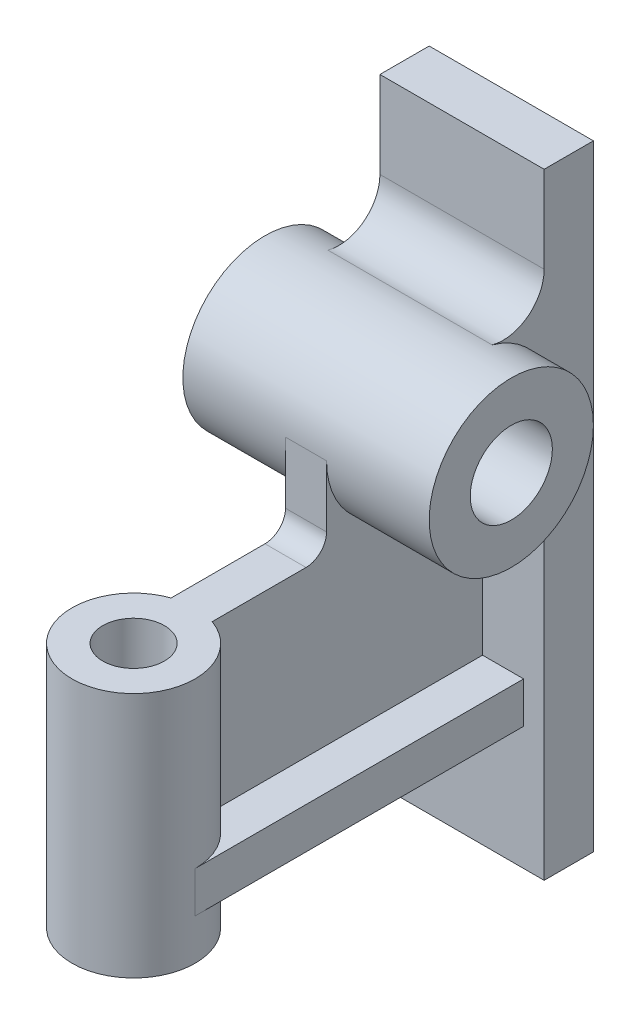
ISO-10303-21;
HEADER;
FILE_DESCRIPTION(('STEP AP214'),'2;1');
FILE_NAME('part.step','',(''),(''),'','','');
FILE_SCHEMA(('AUTOMOTIVE_DESIGN { 1 0 10303 214 1 1 1 1 }'));
ENDSEC;
DATA;
#1=APPLICATION_CONTEXT('core data for automotive mechanical design processes');
#2=APPLICATION_PROTOCOL_DEFINITION('international standard','automotive_design',2000,#1);
#3=PRODUCT_CONTEXT('',#1,'mechanical');
#4=PRODUCT('Part','Part','',(#3));
#5=PRODUCT_RELATED_PRODUCT_CATEGORY('part','',(#4));
#6=PRODUCT_DEFINITION_FORMATION('','',#4);
#7=PRODUCT_DEFINITION_CONTEXT('part definition',#1,'design');
#8=PRODUCT_DEFINITION('design','',#6,#7);
#9=PRODUCT_DEFINITION_SHAPE('','',#8);
#10=(LENGTH_UNIT() NAMED_UNIT(*) SI_UNIT(.MILLI.,.METRE.));
#11=(NAMED_UNIT(*) PLANE_ANGLE_UNIT() SI_UNIT($,.RADIAN.));
#12=(NAMED_UNIT(*) SI_UNIT($,.STERADIAN.) SOLID_ANGLE_UNIT());
#13=UNCERTAINTY_MEASURE_WITH_UNIT(LENGTH_MEASURE(1.E-05),#10,'distance_accuracy_value','');
#14=(GEOMETRIC_REPRESENTATION_CONTEXT(3) GLOBAL_UNCERTAINTY_ASSIGNED_CONTEXT((#13)) GLOBAL_UNIT_ASSIGNED_CONTEXT((#10,
#11,#12)) REPRESENTATION_CONTEXT('',''));
#15=CARTESIAN_POINT('',(0.,0.,0.));
#16=DIRECTION('',(0.,0.,1.));
#17=DIRECTION('',(1.,0.,0.));
#18=AXIS2_PLACEMENT_3D('',#15,#16,#17);
#19=CARTESIAN_POINT('',(15.,40.,12.));
#20=DIRECTION('',(0.,-1.,0.));
#21=DIRECTION('',(0.,0.,-1.));
#22=AXIS2_PLACEMENT_3D('',#19,#20,#21);
#23=PLANE('',#22);
#24=DIRECTION('',(0.,0.,1.));
#25=VECTOR('',#24,1.);
#26=CARTESIAN_POINT('',(-5.,40.,12.));
#27=LINE('',#26,#25);
#28=CARTESIAN_POINT('',(-5.,40.,12.));
#29=VERTEX_POINT('',#28);
#30=CARTESIAN_POINT('',(-5.,40.,77.857864376269));
#31=VERTEX_POINT('',#30);
#32=EDGE_CURVE('E213',#29,#31,#27,.T.);
#33=ORIENTED_EDGE('',*,*,#32,.F.);
#34=DIRECTION('',(-1.,0.,0.));
#35=VECTOR('',#34,1.);
#36=CARTESIAN_POINT('',(15.,40.,12.));
#37=LINE('',#36,#35);
#38=CARTESIAN_POINT('',(-15.,40.,12.));
#39=VERTEX_POINT('',#38);
#40=EDGE_CURVE('E272',#29,#39,#37,.T.);
#41=ORIENTED_EDGE('',*,*,#40,.T.);
#42=DIRECTION('',(0.,0.,1.));
#43=VECTOR('',#42,1.);
#44=CARTESIAN_POINT('',(-15.,40.,12.));
#45=LINE('',#44,#43);
#46=CARTESIAN_POINT('',(-15.,40.,92.));
#47=VERTEX_POINT('',#46);
#48=EDGE_CURVE('E266',#39,#47,#45,.T.);
#49=ORIENTED_EDGE('',*,*,#48,.T.);
#50=CARTESIAN_POINT('',(0.,40.,92.));
#51=DIRECTION('',(0.,-1.,0.));
#52=DIRECTION('',(0.,0.,-1.));
#53=AXIS2_PLACEMENT_3D('',#50,#51,#52);
#54=CIRCLE('',#53,15.);
#55=EDGE_CURVE('E239',#47,#31,#54,.T.);
#56=ORIENTED_EDGE('',*,*,#55,.T.);
#57=EDGE_LOOP('',(#33,#41,#49,#56));
#58=FACE_BOUND('',#57,.T.);
#59=ADVANCED_FACE('F39',(#58),#23,.F.);
#60=CARTESIAN_POINT('',(20.,150.,12.));
#61=DIRECTION('',(0.,0.,-1.));
#62=DIRECTION('',(0.,1.,0.));
#63=AXIS2_PLACEMENT_3D('',#60,#61,#62);
#64=PLANE('',#63);
#65=DIRECTION('',(-1.,0.,0.));
#66=VECTOR('',#65,1.);
#67=CARTESIAN_POINT('',(30.,91.2822021129186,12.));
#68=LINE('',#67,#66);
#69=CARTESIAN_POINT('',(5.,91.2822021129186,12.));
#70=VERTEX_POINT('',#69);
#71=CARTESIAN_POINT('',(20.,91.2822021129186,12.));
#72=VERTEX_POINT('',#71);
#73=EDGE_CURVE('E288',#70,#72,#68,.F.);
#74=ORIENTED_EDGE('',*,*,#73,.F.);
#75=DIRECTION('',(0.,-1.,0.));
#76=VECTOR('',#75,1.);
#77=CARTESIAN_POINT('',(5.,150.,12.));
#78=LINE('',#77,#76);
#79=CARTESIAN_POINT('',(5.,40.,12.));
#80=VERTEX_POINT('',#79);
#81=EDGE_CURVE('E222',#70,#80,#78,.T.);
#82=ORIENTED_EDGE('',*,*,#81,.T.);
#83=CARTESIAN_POINT('',(15.,40.,12.));
#84=VERTEX_POINT('',#83);
#85=EDGE_CURVE('E273',#84,#80,#37,.T.);
#86=ORIENTED_EDGE('',*,*,#85,.F.);
#87=DIRECTION('',(0.,1.,0.));
#88=VECTOR('',#87,1.);
#89=CARTESIAN_POINT('',(15.,30.,12.));
#90=LINE('',#89,#88);
#91=CARTESIAN_POINT('',(15.,30.,12.));
#92=VERTEX_POINT('',#91);
#93=EDGE_CURVE('E252',#92,#84,#90,.T.);
#94=ORIENTED_EDGE('',*,*,#93,.F.);
#95=DIRECTION('',(-1.,0.,0.));
#96=VECTOR('',#95,1.);
#97=CARTESIAN_POINT('',(15.,30.,12.));
#98=LINE('',#97,#96);
#99=CARTESIAN_POINT('',(-15.,30.,12.));
#100=VERTEX_POINT('',#99);
#101=EDGE_CURVE('E276',#92,#100,#98,.T.);
#102=ORIENTED_EDGE('',*,*,#101,.T.);
#103=DIRECTION('',(0.,1.,0.));
#104=VECTOR('',#103,1.);
#105=CARTESIAN_POINT('',(-15.,30.,12.));
#106=LINE('',#105,#104);
#107=EDGE_CURVE('E263',#100,#39,#106,.T.);
#108=ORIENTED_EDGE('',*,*,#107,.T.);
#109=ORIENTED_EDGE('',*,*,#40,.F.);
#110=DIRECTION('',(0.,-1.,0.));
#111=VECTOR('',#110,1.);
#112=CARTESIAN_POINT('',(-5.,150.,12.));
#113=LINE('',#112,#111);
#114=CARTESIAN_POINT('',(-5.,91.2822021129186,12.));
#115=VERTEX_POINT('',#114);
#116=EDGE_CURVE('E214',#115,#29,#113,.T.);
#117=ORIENTED_EDGE('',*,*,#116,.F.);
#118=CARTESIAN_POINT('',(-20.,91.2822021129186,12.));
#119=VERTEX_POINT('',#118);
#120=EDGE_CURVE('E291',#119,#115,#68,.F.);
#121=ORIENTED_EDGE('',*,*,#120,.F.);
#122=DIRECTION('',(0.,-1.,0.));
#123=VECTOR('',#122,1.);
#124=CARTESIAN_POINT('',(-20.,150.,12.));
#125=LINE('',#124,#123);
#126=CARTESIAN_POINT('',(-20.,0.,12.));
#127=VERTEX_POINT('',#126);
#128=EDGE_CURVE('E319',#119,#127,#125,.T.);
#129=ORIENTED_EDGE('',*,*,#128,.T.);
#130=DIRECTION('',(-1.,0.,0.));
#131=VECTOR('',#130,1.);
#132=CARTESIAN_POINT('',(20.,0.,12.));
#133=LINE('',#132,#131);
#134=CARTESIAN_POINT('',(20.,0.,12.));
#135=VERTEX_POINT('',#134);
#136=EDGE_CURVE('E310',#135,#127,#133,.T.);
#137=ORIENTED_EDGE('',*,*,#136,.F.);
#138=DIRECTION('',(0.,-1.,0.));
#139=VECTOR('',#138,1.);
#140=CARTESIAN_POINT('',(20.,150.,12.));
#141=LINE('',#140,#139);
#142=EDGE_CURVE('E306',#72,#135,#141,.T.);
#143=ORIENTED_EDGE('',*,*,#142,.F.);
#144=EDGE_LOOP('',(#74,#82,#86,#94,#102,#108,#109,#117,#121,#129,#137,#143));
#145=FACE_BOUND('',#144,.T.);
#146=ADVANCED_FACE('F369',(#145),#64,.F.);
#147=DIRECTION('',(-1.,0.,0.));
#148=VECTOR('',#147,1.);
#149=CARTESIAN_POINT('',(20.,150.,12.));
#150=LINE('',#149,#148);
#151=CARTESIAN_POINT('',(20.,150.,12.));
#152=VERTEX_POINT('',#151);
#153=CARTESIAN_POINT('',(-20.,150.,12.));
#154=VERTEX_POINT('',#153);
#155=EDGE_CURVE('E323',#152,#154,#150,.T.);
#156=ORIENTED_EDGE('',*,*,#155,.T.);
#157=CARTESIAN_POINT('',(-20.,128.913664589602,12.));
#158=VERTEX_POINT('',#157);
#159=EDGE_CURVE('E302',#154,#158,#125,.T.);
#160=ORIENTED_EDGE('',*,*,#159,.T.);
#161=DIRECTION('',(1.,0.,0.));
#162=VECTOR('',#161,1.);
#163=CARTESIAN_POINT('',(20.,128.913664589602,12.));
#164=LINE('',#163,#162);
#165=CARTESIAN_POINT('',(20.,128.913664589602,12.));
#166=VERTEX_POINT('',#165);
#167=EDGE_CURVE('E334',#158,#166,#164,.T.);
#168=ORIENTED_EDGE('',*,*,#167,.T.);
#169=EDGE_CURVE('E307',#152,#166,#141,.T.);
#170=ORIENTED_EDGE('',*,*,#169,.F.);
#171=EDGE_LOOP('',(#156,#160,#168,#170));
#172=FACE_BOUND('',#171,.T.);
#173=ADVANCED_FACE('F375',(#172),#64,.F.);
#174=CARTESIAN_POINT('',(20.,0.,12.));
#175=DIRECTION('',(0.,1.,0.));
#176=DIRECTION('',(0.,0.,1.));
#177=AXIS2_PLACEMENT_3D('',#174,#175,#176);
#178=PLANE('',#177);
#179=ORIENTED_EDGE('',*,*,#136,.T.);
#180=DIRECTION('',(0.,0.,-1.));
#181=VECTOR('',#180,1.);
#182=CARTESIAN_POINT('',(-20.,0.,12.));
#183=LINE('',#182,#181);
#184=CARTESIAN_POINT('',(-20.,0.,0.));
#185=VERTEX_POINT('',#184);
#186=EDGE_CURVE('E297',#127,#185,#183,.T.);
#187=ORIENTED_EDGE('',*,*,#186,.T.);
#188=DIRECTION('',(-1.,0.,0.));
#189=VECTOR('',#188,1.);
#190=CARTESIAN_POINT('',(20.,0.,0.));
#191=LINE('',#190,#189);
#192=CARTESIAN_POINT('',(20.,0.,0.));
#193=VERTEX_POINT('',#192);
#194=EDGE_CURVE('E327',#193,#185,#191,.T.);
#195=ORIENTED_EDGE('',*,*,#194,.F.);
#196=DIRECTION('',(0.,0.,-1.));
#197=VECTOR('',#196,1.);
#198=CARTESIAN_POINT('',(20.,0.,12.));
#199=LINE('',#198,#197);
#200=EDGE_CURVE('E298',#135,#193,#199,.T.);
#201=ORIENTED_EDGE('',*,*,#200,.F.);
#202=EDGE_LOOP('',(#179,#187,#195,#201));
#203=FACE_BOUND('',#202,.T.);
#204=ADVANCED_FACE('F443',(#203),#178,.F.);
#205=CARTESIAN_POINT('',(20.,0.,0.));
#206=DIRECTION('',(0.,0.,1.));
#207=DIRECTION('',(1.,0.,0.));
#208=AXIS2_PLACEMENT_3D('',#205,#206,#207);
#209=PLANE('',#208);
#210=ORIENTED_EDGE('',*,*,#194,.T.);
#211=DIRECTION('',(0.,1.,0.));
#212=VECTOR('',#211,1.);
#213=CARTESIAN_POINT('',(-20.,0.,0.));
#214=LINE('',#213,#212);
#215=CARTESIAN_POINT('',(-20.,150.,0.));
#216=VERTEX_POINT('',#215);
#217=EDGE_CURVE('E313',#185,#216,#214,.T.);
#218=ORIENTED_EDGE('',*,*,#217,.T.);
#219=DIRECTION('',(-1.,0.,0.));
#220=VECTOR('',#219,1.);
#221=CARTESIAN_POINT('',(20.,150.,0.));
#222=LINE('',#221,#220);
#223=CARTESIAN_POINT('',(20.,150.,0.));
#224=VERTEX_POINT('',#223);
#225=EDGE_CURVE('E325',#224,#216,#222,.T.);
#226=ORIENTED_EDGE('',*,*,#225,.F.);
#227=DIRECTION('',(0.,1.,0.));
#228=VECTOR('',#227,1.);
#229=CARTESIAN_POINT('',(20.,0.,0.));
#230=LINE('',#229,#228);
#231=EDGE_CURVE('E301',#193,#224,#230,.T.);
#232=ORIENTED_EDGE('',*,*,#231,.F.);
#233=EDGE_LOOP('',(#210,#218,#226,#232));
#234=FACE_BOUND('',#233,.T.);
#235=ADVANCED_FACE('F446',(#234),#209,.F.);
#236=CARTESIAN_POINT('',(20.,150.,0.));
#237=DIRECTION('',(0.,-1.,0.));
#238=DIRECTION('',(0.,0.,-1.));
#239=AXIS2_PLACEMENT_3D('',#236,#237,#238);
#240=PLANE('',#239);
#241=ORIENTED_EDGE('',*,*,#225,.T.);
#242=DIRECTION('',(0.,0.,1.));
#243=VECTOR('',#242,1.);
#244=CARTESIAN_POINT('',(-20.,150.,0.));
#245=LINE('',#244,#243);
#246=EDGE_CURVE('E316',#216,#154,#245,.T.);
#247=ORIENTED_EDGE('',*,*,#246,.T.);
#248=ORIENTED_EDGE('',*,*,#155,.F.);
#249=DIRECTION('',(0.,0.,1.));
#250=VECTOR('',#249,1.);
#251=CARTESIAN_POINT('',(20.,150.,0.));
#252=LINE('',#251,#250);
#253=EDGE_CURVE('E304',#224,#152,#252,.T.);
#254=ORIENTED_EDGE('',*,*,#253,.F.);
#255=EDGE_LOOP('',(#241,#247,#248,#254));
#256=FACE_BOUND('',#255,.T.);
#257=ADVANCED_FACE('F437',(#256),#240,.F.);
#258=CARTESIAN_POINT('',(20.,0.,0.));
#259=DIRECTION('',(1.,0.,0.));
#260=DIRECTION('',(0.,0.,-1.));
#261=AXIS2_PLACEMENT_3D('',#258,#259,#260);
#262=PLANE('',#261);
#263=ORIENTED_EDGE('',*,*,#169,.T.);
#264=CARTESIAN_POINT('',(20.,128.913664589602,22.));
#265=DIRECTION('',(1.,0.,0.));
#266=DIRECTION('',(0.,0.,-1.));
#267=AXIS2_PLACEMENT_3D('',#264,#265,#266);
#268=CIRCLE('',#267,10.);
#269=CARTESIAN_POINT('',(20.,119.275776393068,24.6666666666667));
#270=VERTEX_POINT('',#269);
#271=EDGE_CURVE('E338',#166,#270,#268,.F.);
#272=ORIENTED_EDGE('',*,*,#271,.T.);
#273=CARTESIAN_POINT('',(20.,100.,30.));
#274=DIRECTION('',(1.,0.,0.));
#275=DIRECTION('',(0.,0.,-1.));
#276=AXIS2_PLACEMENT_3D('',#273,#274,#275);
#277=CIRCLE('',#276,20.);
#278=EDGE_CURVE('E294',#270,#72,#277,.F.);
#279=ORIENTED_EDGE('',*,*,#278,.T.);
#280=ORIENTED_EDGE('',*,*,#142,.T.);
#281=ORIENTED_EDGE('',*,*,#200,.T.);
#282=ORIENTED_EDGE('',*,*,#231,.T.);
#283=ORIENTED_EDGE('',*,*,#253,.T.);
#284=EDGE_LOOP('',(#263,#272,#279,#280,#281,#282,#283));
#285=FACE_BOUND('',#284,.T.);
#286=ADVANCED_FACE('F432',(#285),#262,.T.);
#287=CARTESIAN_POINT('',(-20.,0.,0.));
#288=DIRECTION('',(1.,0.,0.));
#289=DIRECTION('',(0.,0.,-1.));
#290=AXIS2_PLACEMENT_3D('',#287,#288,#289);
#291=PLANE('',#290);
#292=CARTESIAN_POINT('',(-20.,100.,30.));
#293=DIRECTION('',(1.,0.,0.));
#294=DIRECTION('',(0.,0.,-1.));
#295=AXIS2_PLACEMENT_3D('',#292,#293,#294);
#296=CIRCLE('',#295,20.);
#297=CARTESIAN_POINT('',(-20.,119.275776393068,24.6666666666667));
#298=VERTEX_POINT('',#297);
#299=EDGE_CURVE('E329',#298,#119,#296,.F.);
#300=ORIENTED_EDGE('',*,*,#299,.F.);
#301=CARTESIAN_POINT('',(-20.,128.913664589602,22.));
#302=DIRECTION('',(1.,0.,0.));
#303=DIRECTION('',(0.,0.,-1.));
#304=AXIS2_PLACEMENT_3D('',#301,#302,#303);
#305=CIRCLE('',#304,10.);
#306=EDGE_CURVE('E336',#298,#158,#305,.T.);
#307=ORIENTED_EDGE('',*,*,#306,.T.);
#308=ORIENTED_EDGE('',*,*,#159,.F.);
#309=ORIENTED_EDGE('',*,*,#246,.F.);
#310=ORIENTED_EDGE('',*,*,#217,.F.);
#311=ORIENTED_EDGE('',*,*,#186,.F.);
#312=ORIENTED_EDGE('',*,*,#128,.F.);
#313=EDGE_LOOP('',(#300,#307,#308,#309,#310,#311,#312));
#314=FACE_BOUND('',#313,.T.);
#315=ADVANCED_FACE('F423',(#314),#291,.F.);
#316=CARTESIAN_POINT('',(30.,100.,30.));
#317=DIRECTION('',(1.,0.,0.));
#318=DIRECTION('',(0.,0.,-1.));
#319=AXIS2_PLACEMENT_3D('',#316,#317,#318);
#320=PLANE('',#319);
#321=CARTESIAN_POINT('',(30.,100.,30.));
#322=DIRECTION('',(1.,0.,0.));
#323=DIRECTION('',(0.,0.,-1.));
#324=AXIS2_PLACEMENT_3D('',#321,#322,#323);
#325=CIRCLE('',#324,20.);
#326=CARTESIAN_POINT('',(30.,100.,9.99999999999998));
#327=VERTEX_POINT('',#326);
#328=EDGE_CURVE('E285',#327,#327,#325,.T.);
#329=ORIENTED_EDGE('',*,*,#328,.T.);
#330=EDGE_LOOP('',(#329));
#331=FACE_BOUND('',#330,.T.);
#332=CARTESIAN_POINT('',(30.,100.,30.));
#333=DIRECTION('',(1.,0.,0.));
#334=DIRECTION('',(0.,0.,-1.));
#335=AXIS2_PLACEMENT_3D('',#332,#333,#334);
#336=CIRCLE('',#335,10.);
#337=CARTESIAN_POINT('',(30.,100.,20.));
#338=VERTEX_POINT('',#337);
#339=EDGE_CURVE('E279',#338,#338,#336,.T.);
#340=ORIENTED_EDGE('',*,*,#339,.F.);
#341=EDGE_LOOP('',(#340));
#342=FACE_BOUND('',#341,.T.);
#343=ADVANCED_FACE('F457',(#331,#342),#320,.T.);
#344=CARTESIAN_POINT('',(-30.,100.,30.));
#345=DIRECTION('',(1.,0.,0.));
#346=DIRECTION('',(0.,0.,-1.));
#347=AXIS2_PLACEMENT_3D('',#344,#345,#346);
#348=PLANE('',#347);
#349=CARTESIAN_POINT('',(-30.,100.,30.));
#350=DIRECTION('',(1.,0.,0.));
#351=DIRECTION('',(0.,0.,-1.));
#352=AXIS2_PLACEMENT_3D('',#349,#350,#351);
#353=CIRCLE('',#352,20.);
#354=CARTESIAN_POINT('',(-30.,100.,9.99999999999998));
#355=VERTEX_POINT('',#354);
#356=EDGE_CURVE('E282',#355,#355,#353,.T.);
#357=ORIENTED_EDGE('',*,*,#356,.F.);
#358=EDGE_LOOP('',(#357));
#359=FACE_BOUND('',#358,.T.);
#360=CARTESIAN_POINT('',(-30.,100.,30.));
#361=DIRECTION('',(1.,0.,0.));
#362=DIRECTION('',(0.,0.,-1.));
#363=AXIS2_PLACEMENT_3D('',#360,#361,#362);
#364=CIRCLE('',#363,10.);
#365=CARTESIAN_POINT('',(-30.,100.,20.));
#366=VERTEX_POINT('',#365);
#367=EDGE_CURVE('E278',#366,#366,#364,.T.);
#368=ORIENTED_EDGE('',*,*,#367,.T.);
#369=EDGE_LOOP('',(#368));
#370=FACE_BOUND('',#369,.T.);
#371=ADVANCED_FACE('F463',(#359,#370),#348,.F.);
#372=CARTESIAN_POINT('',(30.,100.,30.));
#373=DIRECTION('',(-1.,0.,0.));
#374=DIRECTION('',(0.,0.,1.));
#375=AXIS2_PLACEMENT_3D('',#372,#373,#374);
#376=CYLINDRICAL_SURFACE('',#375,20.);
#377=DIRECTION('',(-1.,0.,0.));
#378=VECTOR('',#377,1.);
#379=CARTESIAN_POINT('',(30.,119.275776393068,24.6666666666667));
#380=LINE('',#379,#378);
#381=EDGE_CURVE('E332',#270,#298,#380,.T.);
#382=ORIENTED_EDGE('',*,*,#381,.T.);
#383=ORIENTED_EDGE('',*,*,#299,.T.);
#384=ORIENTED_EDGE('',*,*,#120,.T.);
#385=CARTESIAN_POINT('',(-5.,100.,30.));
#386=DIRECTION('',(1.,0.,0.));
#387=DIRECTION('',(0.,0.,-1.));
#388=AXIS2_PLACEMENT_3D('',#385,#386,#387);
#389=CIRCLE('',#388,20.);
#390=CARTESIAN_POINT('',(-5.,100.,50.));
#391=VERTEX_POINT('',#390);
#392=EDGE_CURVE('E209',#391,#115,#389,.T.);
#393=ORIENTED_EDGE('',*,*,#392,.F.);
#394=DIRECTION('',(-1.,0.,0.));
#395=VECTOR('',#394,1.);
#396=CARTESIAN_POINT('',(30.,100.,50.));
#397=LINE('',#396,#395);
#398=CARTESIAN_POINT('',(5.,100.,50.));
#399=VERTEX_POINT('',#398);
#400=EDGE_CURVE('E11',#391,#399,#397,.F.);
#401=ORIENTED_EDGE('',*,*,#400,.T.);
#402=CARTESIAN_POINT('',(5.,100.,30.));
#403=DIRECTION('',(1.,0.,0.));
#404=DIRECTION('',(0.,0.,-1.));
#405=AXIS2_PLACEMENT_3D('',#402,#403,#404);
#406=CIRCLE('',#405,20.);
#407=EDGE_CURVE('E212',#399,#70,#406,.T.);
#408=ORIENTED_EDGE('',*,*,#407,.T.);
#409=ORIENTED_EDGE('',*,*,#73,.T.);
#410=ORIENTED_EDGE('',*,*,#278,.F.);
#411=EDGE_LOOP('',(#382,#383,#384,#393,#401,#408,#409,#410));
#412=FACE_BOUND('',#411,.T.);
#413=ORIENTED_EDGE('',*,*,#328,.F.);
#414=EDGE_LOOP('',(#413));
#415=FACE_BOUND('',#414,.T.);
#416=ORIENTED_EDGE('',*,*,#356,.T.);
#417=EDGE_LOOP('',(#416));
#418=FACE_BOUND('',#417,.T.);
#419=ADVANCED_FACE('F397',(#412,#415,#418),#376,.T.);
#420=CARTESIAN_POINT('',(30.,100.,30.));
#421=DIRECTION('',(-1.,0.,0.));
#422=DIRECTION('',(0.,0.,1.));
#423=AXIS2_PLACEMENT_3D('',#420,#421,#422);
#424=CYLINDRICAL_SURFACE('',#423,10.);
#425=ORIENTED_EDGE('',*,*,#339,.T.);
#426=EDGE_LOOP('',(#425));
#427=FACE_BOUND('',#426,.T.);
#428=ORIENTED_EDGE('',*,*,#367,.F.);
#429=EDGE_LOOP('',(#428));
#430=FACE_BOUND('',#429,.T.);
#431=ADVANCED_FACE('F462',(#427,#430),#424,.F.);
#432=CARTESIAN_POINT('',(30.,128.913664589602,22.));
#433=DIRECTION('',(-1.,0.,0.));
#434=DIRECTION('',(0.,0.,1.));
#435=AXIS2_PLACEMENT_3D('',#432,#433,#434);
#436=CYLINDRICAL_SURFACE('',#435,10.);
#437=ORIENTED_EDGE('',*,*,#271,.F.);
#438=ORIENTED_EDGE('',*,*,#167,.F.);
#439=ORIENTED_EDGE('',*,*,#306,.F.);
#440=ORIENTED_EDGE('',*,*,#381,.F.);
#441=EDGE_LOOP('',(#437,#438,#439,#440));
#442=FACE_BOUND('',#441,.T.);
#443=ADVANCED_FACE('F41',(#442),#436,.F.);
#444=CARTESIAN_POINT('',(15.,30.,12.));
#445=DIRECTION('',(0.,1.,0.));
#446=DIRECTION('',(0.,0.,1.));
#447=AXIS2_PLACEMENT_3D('',#444,#445,#446);
#448=PLANE('',#447);
#449=CARTESIAN_POINT('',(0.,30.,92.));
#450=DIRECTION('',(0.,1.,0.));
#451=DIRECTION('',(0.,0.,1.));
#452=AXIS2_PLACEMENT_3D('',#449,#450,#451);
#453=CIRCLE('',#452,15.);
#454=CARTESIAN_POINT('',(15.,30.,92.));
#455=VERTEX_POINT('',#454);
#456=CARTESIAN_POINT('',(-15.,30.,92.));
#457=VERTEX_POINT('',#456);
#458=EDGE_CURVE('E242',#455,#457,#453,.T.);
#459=ORIENTED_EDGE('',*,*,#458,.T.);
#460=DIRECTION('',(0.,0.,-1.));
#461=VECTOR('',#460,1.);
#462=CARTESIAN_POINT('',(-15.,30.,12.));
#463=LINE('',#462,#461);
#464=EDGE_CURVE('E249',#457,#100,#463,.T.);
#465=ORIENTED_EDGE('',*,*,#464,.T.);
#466=ORIENTED_EDGE('',*,*,#101,.F.);
#467=DIRECTION('',(0.,0.,-1.));
#468=VECTOR('',#467,1.);
#469=CARTESIAN_POINT('',(15.,30.,12.));
#470=LINE('',#469,#468);
#471=EDGE_CURVE('E250',#455,#92,#470,.T.);
#472=ORIENTED_EDGE('',*,*,#471,.F.);
#473=EDGE_LOOP('',(#459,#465,#466,#472));
#474=FACE_BOUND('',#473,.T.);
#475=ADVANCED_FACE('F355',(#474),#448,.F.);
#476=ORIENTED_EDGE('',*,*,#85,.T.);
#477=DIRECTION('',(0.,0.,1.));
#478=VECTOR('',#477,1.);
#479=CARTESIAN_POINT('',(5.,40.,12.));
#480=LINE('',#479,#478);
#481=CARTESIAN_POINT('',(5.,40.,77.857864376269));
#482=VERTEX_POINT('',#481);
#483=EDGE_CURVE('E221',#80,#482,#480,.T.);
#484=ORIENTED_EDGE('',*,*,#483,.T.);
#485=CARTESIAN_POINT('',(15.,40.,92.));
#486=VERTEX_POINT('',#485);
#487=EDGE_CURVE('E238',#482,#486,#54,.T.);
#488=ORIENTED_EDGE('',*,*,#487,.T.);
#489=DIRECTION('',(0.,0.,1.));
#490=VECTOR('',#489,1.);
#491=CARTESIAN_POINT('',(15.,40.,12.));
#492=LINE('',#491,#490);
#493=EDGE_CURVE('E255',#84,#486,#492,.T.);
#494=ORIENTED_EDGE('',*,*,#493,.F.);
#495=EDGE_LOOP('',(#476,#484,#488,#494));
#496=FACE_BOUND('',#495,.T.);
#497=ADVANCED_FACE('F364',(#496),#23,.F.);
#498=CARTESIAN_POINT('',(15.,0.,0.));
#499=DIRECTION('',(-1.,0.,0.));
#500=DIRECTION('',(0.,0.,1.));
#501=AXIS2_PLACEMENT_3D('',#498,#499,#500);
#502=PLANE('',#501);
#503=ORIENTED_EDGE('',*,*,#471,.T.);
#504=ORIENTED_EDGE('',*,*,#93,.T.);
#505=ORIENTED_EDGE('',*,*,#493,.T.);
#506=DIRECTION('',(0.,-1.,0.));
#507=VECTOR('',#506,1.);
#508=CARTESIAN_POINT('',(15.,30.,92.));
#509=LINE('',#508,#507);
#510=EDGE_CURVE('E258',#486,#455,#509,.T.);
#511=ORIENTED_EDGE('',*,*,#510,.T.);
#512=EDGE_LOOP('',(#503,#504,#505,#511));
#513=FACE_BOUND('',#512,.T.);
#514=ADVANCED_FACE('F381',(#513),#502,.F.);
#515=CARTESIAN_POINT('',(-15.,0.,0.));
#516=DIRECTION('',(-1.,0.,0.));
#517=DIRECTION('',(0.,0.,1.));
#518=AXIS2_PLACEMENT_3D('',#515,#516,#517);
#519=PLANE('',#518);
#520=ORIENTED_EDGE('',*,*,#464,.F.);
#521=DIRECTION('',(0.,-1.,0.));
#522=VECTOR('',#521,1.);
#523=CARTESIAN_POINT('',(-15.,30.,92.));
#524=LINE('',#523,#522);
#525=EDGE_CURVE('E253',#47,#457,#524,.T.);
#526=ORIENTED_EDGE('',*,*,#525,.F.);
#527=ORIENTED_EDGE('',*,*,#48,.F.);
#528=ORIENTED_EDGE('',*,*,#107,.F.);
#529=EDGE_LOOP('',(#520,#526,#527,#528));
#530=FACE_BOUND('',#529,.T.);
#531=ADVANCED_FACE('F387',(#530),#519,.T.);
#532=CARTESIAN_POINT('',(0.,20.,92.));
#533=DIRECTION('',(0.,1.,0.));
#534=DIRECTION('',(0.,0.,1.));
#535=AXIS2_PLACEMENT_3D('',#532,#533,#534);
#536=CYLINDRICAL_SURFACE('',#535,7.5);
#537=CARTESIAN_POINT('',(0.,40.,92.));
#538=DIRECTION('',(0.,-1.,0.));
#539=DIRECTION('',(0.,0.,-1.));
#540=AXIS2_PLACEMENT_3D('',#537,#538,#539);
#541=CIRCLE('',#540,7.5);
#542=CARTESIAN_POINT('',(-7.5,40.,92.));
#543=VERTEX_POINT('',#542);
#544=CARTESIAN_POINT('',(7.5,40.,92.));
#545=VERTEX_POINT('',#544);
#546=EDGE_CURVE('E244',#543,#545,#541,.T.);
#547=ORIENTED_EDGE('',*,*,#546,.T.);
#548=DIRECTION('',(0.,1.,0.));
#549=VECTOR('',#548,1.);
#550=CARTESIAN_POINT('',(7.5,20.,92.));
#551=LINE('',#550,#549);
#552=CARTESIAN_POINT('',(7.5,30.,92.));
#553=VERTEX_POINT('',#552);
#554=EDGE_CURVE('E341',#545,#553,#551,.F.);
#555=ORIENTED_EDGE('',*,*,#554,.T.);
#556=CARTESIAN_POINT('',(0.,30.,92.));
#557=DIRECTION('',(0.,1.,0.));
#558=DIRECTION('',(0.,0.,1.));
#559=AXIS2_PLACEMENT_3D('',#556,#557,#558);
#560=CIRCLE('',#559,7.5);
#561=CARTESIAN_POINT('',(-7.5,30.,92.));
#562=VERTEX_POINT('',#561);
#563=EDGE_CURVE('E246',#553,#562,#560,.T.);
#564=ORIENTED_EDGE('',*,*,#563,.T.);
#565=DIRECTION('',(0.,1.,0.));
#566=VECTOR('',#565,1.);
#567=CARTESIAN_POINT('',(-7.5,20.,92.));
#568=LINE('',#567,#566);
#569=EDGE_CURVE('E47',#562,#543,#568,.T.);
#570=ORIENTED_EDGE('',*,*,#569,.T.);
#571=EDGE_LOOP('',(#547,#555,#564,#570));
#572=FACE_BOUND('',#571,.T.);
#573=CARTESIAN_POINT('',(0.,20.,92.));
#574=DIRECTION('',(0.,1.,0.));
#575=DIRECTION('',(0.,0.,1.));
#576=AXIS2_PLACEMENT_3D('',#573,#574,#575);
#577=CIRCLE('',#576,7.5);
#578=CARTESIAN_POINT('',(0.,20.,99.5));
#579=VERTEX_POINT('',#578);
#580=EDGE_CURVE('E232',#579,#579,#577,.T.);
#581=ORIENTED_EDGE('',*,*,#580,.F.);
#582=EDGE_LOOP('',(#581));
#583=FACE_BOUND('',#582,.T.);
#584=CARTESIAN_POINT('',(0.,80.,92.));
#585=DIRECTION('',(0.,1.,0.));
#586=DIRECTION('',(0.,0.,1.));
#587=AXIS2_PLACEMENT_3D('',#584,#585,#586);
#588=CIRCLE('',#587,7.5);
#589=CARTESIAN_POINT('',(0.,80.,99.5));
#590=VERTEX_POINT('',#589);
#591=EDGE_CURVE('E220',#590,#590,#588,.T.);
#592=ORIENTED_EDGE('',*,*,#591,.T.);
#593=EDGE_LOOP('',(#592));
#594=FACE_BOUND('',#593,.T.);
#595=ADVANCED_FACE('F345',(#572,#583,#594),#536,.F.);
#596=CARTESIAN_POINT('',(0.,20.,92.));
#597=DIRECTION('',(0.,1.,0.));
#598=DIRECTION('',(0.,0.,1.));
#599=AXIS2_PLACEMENT_3D('',#596,#597,#598);
#600=CYLINDRICAL_SURFACE('',#599,15.);
#601=CARTESIAN_POINT('',(0.,20.,92.));
#602=DIRECTION('',(0.,1.,0.));
#603=DIRECTION('',(0.,0.,1.));
#604=AXIS2_PLACEMENT_3D('',#601,#602,#603);
#605=CIRCLE('',#604,15.);
#606=CARTESIAN_POINT('',(0.,20.,107.));
#607=VERTEX_POINT('',#606);
#608=EDGE_CURVE('E235',#607,#607,#605,.T.);
#609=ORIENTED_EDGE('',*,*,#608,.T.);
#610=EDGE_LOOP('',(#609));
#611=FACE_BOUND('',#610,.T.);
#612=DIRECTION('',(0.,1.,0.));
#613=VECTOR('',#612,1.);
#614=CARTESIAN_POINT('',(5.,20.,77.857864376269));
#615=LINE('',#614,#613);
#616=CARTESIAN_POINT('',(5.,80.,77.857864376269));
#617=VERTEX_POINT('',#616);
#618=EDGE_CURVE('E218',#617,#482,#615,.F.);
#619=ORIENTED_EDGE('',*,*,#618,.F.);
#620=CARTESIAN_POINT('',(0.,80.,92.));
#621=DIRECTION('',(0.,1.,0.));
#622=DIRECTION('',(0.,0.,1.));
#623=AXIS2_PLACEMENT_3D('',#620,#621,#622);
#624=CIRCLE('',#623,15.);
#625=CARTESIAN_POINT('',(-5.,80.,77.857864376269));
#626=VERTEX_POINT('',#625);
#627=EDGE_CURVE('E54',#626,#617,#624,.T.);
#628=ORIENTED_EDGE('',*,*,#627,.F.);
#629=DIRECTION('',(0.,1.,0.));
#630=VECTOR('',#629,1.);
#631=CARTESIAN_POINT('',(-5.,20.,77.857864376269));
#632=LINE('',#631,#630);
#633=EDGE_CURVE('E210',#626,#31,#632,.F.);
#634=ORIENTED_EDGE('',*,*,#633,.T.);
#635=ORIENTED_EDGE('',*,*,#55,.F.);
#636=ORIENTED_EDGE('',*,*,#525,.T.);
#637=ORIENTED_EDGE('',*,*,#458,.F.);
#638=ORIENTED_EDGE('',*,*,#510,.F.);
#639=ORIENTED_EDGE('',*,*,#487,.F.);
#640=EDGE_LOOP('',(#619,#628,#634,#635,#636,#637,#638,#639));
#641=FACE_BOUND('',#640,.T.);
#642=ADVANCED_FACE('F406',(#611,#641),#600,.T.);
#643=CARTESIAN_POINT('',(0.,20.,92.));
#644=DIRECTION('',(0.,1.,0.));
#645=DIRECTION('',(0.,0.,1.));
#646=AXIS2_PLACEMENT_3D('',#643,#644,#645);
#647=PLANE('',#646);
#648=ORIENTED_EDGE('',*,*,#580,.T.);
#649=EDGE_LOOP('',(#648));
#650=FACE_BOUND('',#649,.T.);
#651=ORIENTED_EDGE('',*,*,#608,.F.);
#652=EDGE_LOOP('',(#651));
#653=FACE_BOUND('',#652,.T.);
#654=ADVANCED_FACE('F541',(#650,#653),#647,.F.);
#655=CARTESIAN_POINT('',(0.,80.,92.));
#656=DIRECTION('',(0.,1.,0.));
#657=DIRECTION('',(0.,0.,1.));
#658=AXIS2_PLACEMENT_3D('',#655,#656,#657);
#659=PLANE('',#658);
#660=ORIENTED_EDGE('',*,*,#591,.F.);
#661=EDGE_LOOP('',(#660));
#662=FACE_BOUND('',#661,.T.);
#663=DIRECTION('',(0.,0.,-1.));
#664=VECTOR('',#663,1.);
#665=CARTESIAN_POINT('',(-5.,80.,53.5));
#666=LINE('',#665,#664);
#667=CARTESIAN_POINT('',(-5.,80.,55.));
#668=VERTEX_POINT('',#667);
#669=EDGE_CURVE('E200',#626,#668,#666,.T.);
#670=ORIENTED_EDGE('',*,*,#669,.F.);
#671=ORIENTED_EDGE('',*,*,#627,.T.);
#672=DIRECTION('',(0.,0.,-1.));
#673=VECTOR('',#672,1.);
#674=CARTESIAN_POINT('',(5.,80.,53.5));
#675=LINE('',#674,#673);
#676=CARTESIAN_POINT('',(5.,80.,55.));
#677=VERTEX_POINT('',#676);
#678=EDGE_CURVE('E179',#617,#677,#675,.T.);
#679=ORIENTED_EDGE('',*,*,#678,.T.);
#680=DIRECTION('',(1.,0.,0.));
#681=VECTOR('',#680,1.);
#682=CARTESIAN_POINT('',(0.,80.,55.));
#683=LINE('',#682,#681);
#684=EDGE_CURVE('E182',#668,#677,#683,.T.);
#685=ORIENTED_EDGE('',*,*,#684,.F.);
#686=EDGE_LOOP('',(#670,#671,#679,#685));
#687=FACE_BOUND('',#686,.T.);
#688=ADVANCED_FACE('F181',(#662,#687),#659,.T.);
#689=CARTESIAN_POINT('',(15.,30.,92.));
#690=DIRECTION('',(0.,0.,-1.));
#691=DIRECTION('',(-1.,0.,0.));
#692=AXIS2_PLACEMENT_3D('',#689,#690,#691);
#693=PLANE('',#692);
#694=DIRECTION('',(-1.,0.,0.));
#695=VECTOR('',#694,1.);
#696=CARTESIAN_POINT('',(15.,40.,92.));
#697=LINE('',#696,#695);
#698=EDGE_CURVE('E62',#545,#543,#697,.T.);
#699=ORIENTED_EDGE('',*,*,#698,.T.);
#700=ORIENTED_EDGE('',*,*,#569,.F.);
#701=DIRECTION('',(-1.,0.,0.));
#702=VECTOR('',#701,1.);
#703=CARTESIAN_POINT('',(15.,30.,92.));
#704=LINE('',#703,#702);
#705=EDGE_CURVE('E260',#553,#562,#704,.T.);
#706=ORIENTED_EDGE('',*,*,#705,.F.);
#707=ORIENTED_EDGE('',*,*,#554,.F.);
#708=EDGE_LOOP('',(#699,#700,#706,#707));
#709=FACE_BOUND('',#708,.T.);
#710=ADVANCED_FACE('F348',(#709),#693,.F.);
#711=ORIENTED_EDGE('',*,*,#698,.F.);
#712=ORIENTED_EDGE('',*,*,#546,.F.);
#713=EDGE_LOOP('',(#711,#712));
#714=FACE_BOUND('',#713,.T.);
#715=ADVANCED_FACE('F353',(#714),#23,.F.);
#716=ORIENTED_EDGE('',*,*,#705,.T.);
#717=ORIENTED_EDGE('',*,*,#563,.F.);
#718=EDGE_LOOP('',(#716,#717));
#719=FACE_BOUND('',#718,.T.);
#720=ADVANCED_FACE('F350',(#719),#448,.F.);
#721=CARTESIAN_POINT('',(0.,85.,50.));
#722=DIRECTION('',(0.,0.,-1.));
#723=DIRECTION('',(0.,1.,0.));
#724=AXIS2_PLACEMENT_3D('',#721,#722,#723);
#725=PLANE('',#724);
#726=ORIENTED_EDGE('',*,*,#400,.F.);
#727=DIRECTION('',(0.,1.,0.));
#728=VECTOR('',#727,1.);
#729=CARTESIAN_POINT('',(-5.,75.,50.));
#730=LINE('',#729,#728);
#731=CARTESIAN_POINT('',(-5.,85.,50.));
#732=VERTEX_POINT('',#731);
#733=EDGE_CURVE('E205',#732,#391,#730,.T.);
#734=ORIENTED_EDGE('',*,*,#733,.F.);
#735=DIRECTION('',(1.,0.,0.));
#736=VECTOR('',#735,1.);
#737=CARTESIAN_POINT('',(0.,85.,50.));
#738=LINE('',#737,#736);
#739=CARTESIAN_POINT('',(5.,85.,50.));
#740=VERTEX_POINT('',#739);
#741=EDGE_CURVE('E193',#732,#740,#738,.T.);
#742=ORIENTED_EDGE('',*,*,#741,.T.);
#743=DIRECTION('',(0.,1.,0.));
#744=VECTOR('',#743,1.);
#745=CARTESIAN_POINT('',(5.,75.,50.));
#746=LINE('',#745,#744);
#747=EDGE_CURVE('E198',#740,#399,#746,.T.);
#748=ORIENTED_EDGE('',*,*,#747,.T.);
#749=EDGE_LOOP('',(#726,#734,#742,#748));
#750=FACE_BOUND('',#749,.T.);
#751=ADVANCED_FACE('F352',(#750),#725,.F.);
#752=CARTESIAN_POINT('',(0.,85.,55.));
#753=DIRECTION('',(1.,0.,0.));
#754=DIRECTION('',(0.,0.,-1.));
#755=AXIS2_PLACEMENT_3D('',#752,#753,#754);
#756=CYLINDRICAL_SURFACE('',#755,5.);
#757=ORIENTED_EDGE('',*,*,#741,.F.);
#758=CARTESIAN_POINT('',(-5.,85.,55.));
#759=DIRECTION('',(1.,0.,0.));
#760=DIRECTION('',(0.,0.,-1.));
#761=AXIS2_PLACEMENT_3D('',#758,#759,#760);
#762=CIRCLE('',#761,5.);
#763=EDGE_CURVE('E192',#668,#732,#762,.T.);
#764=ORIENTED_EDGE('',*,*,#763,.F.);
#765=ORIENTED_EDGE('',*,*,#684,.T.);
#766=CARTESIAN_POINT('',(5.,85.,55.));
#767=DIRECTION('',(1.,0.,0.));
#768=DIRECTION('',(0.,0.,-1.));
#769=AXIS2_PLACEMENT_3D('',#766,#767,#768);
#770=CIRCLE('',#769,5.);
#771=EDGE_CURVE('E186',#677,#740,#770,.T.);
#772=ORIENTED_EDGE('',*,*,#771,.T.);
#773=EDGE_LOOP('',(#757,#764,#765,#772));
#774=FACE_BOUND('',#773,.T.);
#775=ADVANCED_FACE('F190',(#774),#756,.F.);
#776=CARTESIAN_POINT('',(5.,75.,53.5));
#777=DIRECTION('',(1.,0.,0.));
#778=DIRECTION('',(0.,0.,-1.));
#779=AXIS2_PLACEMENT_3D('',#776,#777,#778);
#780=PLANE('',#779);
#781=ORIENTED_EDGE('',*,*,#678,.F.);
#782=ORIENTED_EDGE('',*,*,#618,.T.);
#783=ORIENTED_EDGE('',*,*,#483,.F.);
#784=ORIENTED_EDGE('',*,*,#81,.F.);
#785=ORIENTED_EDGE('',*,*,#407,.F.);
#786=ORIENTED_EDGE('',*,*,#747,.F.);
#787=ORIENTED_EDGE('',*,*,#771,.F.);
#788=EDGE_LOOP('',(#781,#782,#783,#784,#785,#786,#787));
#789=FACE_BOUND('',#788,.T.);
#790=ADVANCED_FACE('F196',(#789),#780,.T.);
#791=CARTESIAN_POINT('',(-5.,75.,53.5));
#792=DIRECTION('',(1.,0.,0.));
#793=DIRECTION('',(0.,0.,-1.));
#794=AXIS2_PLACEMENT_3D('',#791,#792,#793);
#795=PLANE('',#794);
#796=ORIENTED_EDGE('',*,*,#633,.F.);
#797=ORIENTED_EDGE('',*,*,#669,.T.);
#798=ORIENTED_EDGE('',*,*,#763,.T.);
#799=ORIENTED_EDGE('',*,*,#733,.T.);
#800=ORIENTED_EDGE('',*,*,#392,.T.);
#801=ORIENTED_EDGE('',*,*,#116,.T.);
#802=ORIENTED_EDGE('',*,*,#32,.T.);
#803=EDGE_LOOP('',(#796,#797,#798,#799,#800,#801,#802));
#804=FACE_BOUND('',#803,.T.);
#805=ADVANCED_FACE('F403',(#804),#795,.F.);
#806=CLOSED_SHELL('',(#59,#146,#173,#204,#235,#257,#286,#315,#343,#371,#419,#431,#443,#475,#497,
#514,#531,#595,#642,#654,#688,#710,#715,#720,#751,#775,#790,#805));
#807=MANIFOLD_SOLID_BREP('B2',#806);
#808=ADVANCED_BREP_SHAPE_REPRESENTATION('',(#18,#807),#14);
#809=SHAPE_DEFINITION_REPRESENTATION(#9,#808);
ENDSEC;
END-ISO-10303-21;
